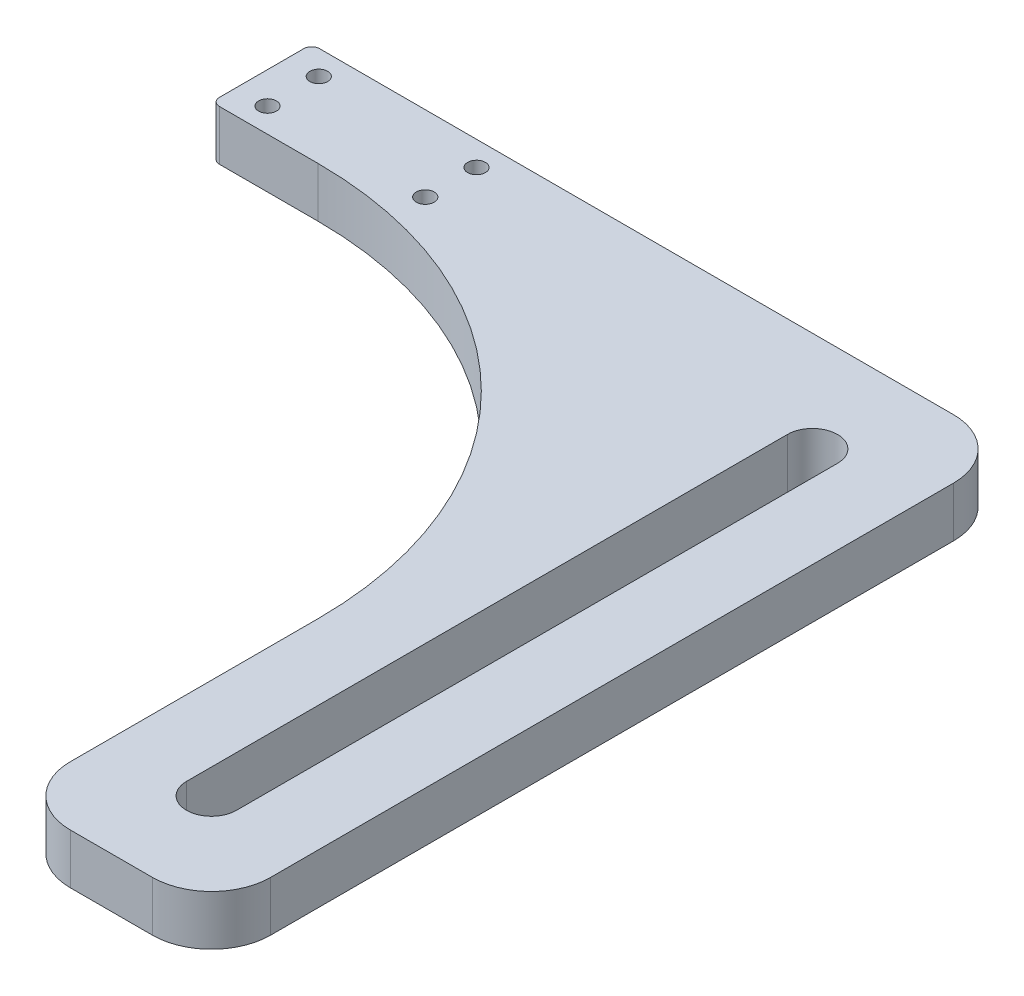
ISO-10303-21;
HEADER;
FILE_DESCRIPTION(('STEP AP214'),'2;1');
FILE_NAME('part.step','',(''),(''),'','','');
FILE_SCHEMA(('AUTOMOTIVE_DESIGN { 1 0 10303 214 1 1 1 1 }'));
ENDSEC;
DATA;
#1=APPLICATION_CONTEXT('core data for automotive mechanical design processes');
#2=APPLICATION_PROTOCOL_DEFINITION('international standard','automotive_design',2000,#1);
#3=PRODUCT_CONTEXT('',#1,'mechanical');
#4=PRODUCT('Part','Part','',(#3));
#5=PRODUCT_RELATED_PRODUCT_CATEGORY('part','',(#4));
#6=PRODUCT_DEFINITION_FORMATION('','',#4);
#7=PRODUCT_DEFINITION_CONTEXT('part definition',#1,'design');
#8=PRODUCT_DEFINITION('design','',#6,#7);
#9=PRODUCT_DEFINITION_SHAPE('','',#8);
#10=(LENGTH_UNIT() NAMED_UNIT(*) SI_UNIT(.MILLI.,.METRE.));
#11=(NAMED_UNIT(*) PLANE_ANGLE_UNIT() SI_UNIT($,.RADIAN.));
#12=(NAMED_UNIT(*) SI_UNIT($,.STERADIAN.) SOLID_ANGLE_UNIT());
#13=UNCERTAINTY_MEASURE_WITH_UNIT(LENGTH_MEASURE(1.E-05),#10,'distance_accuracy_value','');
#14=(GEOMETRIC_REPRESENTATION_CONTEXT(3) GLOBAL_UNCERTAINTY_ASSIGNED_CONTEXT((#13)) GLOBAL_UNIT_ASSIGNED_CONTEXT((#10,
#11,#12)) REPRESENTATION_CONTEXT('',''));
#15=CARTESIAN_POINT('',(0.,0.,0.));
#16=DIRECTION('',(0.,0.,1.));
#17=DIRECTION('',(1.,0.,0.));
#18=AXIS2_PLACEMENT_3D('',#15,#16,#17);
#19=CARTESIAN_POINT('',(-62.7,6.35,11.9));
#20=DIRECTION('',(0.,-1.,0.));
#21=DIRECTION('',(0.,0.,-1.));
#22=AXIS2_PLACEMENT_3D('',#19,#20,#21);
#23=PLANE('',#22);
#24=DIRECTION('',(0.,0.,-1.));
#25=VECTOR('',#24,1.);
#26=CARTESIAN_POINT('',(12.7,6.35,50.8));
#27=LINE('',#26,#25);
#28=CARTESIAN_POINT('',(12.7,6.35,43.3));
#29=VERTEX_POINT('',#28);
#30=CARTESIAN_POINT('',(12.7,6.35,-43.3));
#31=VERTEX_POINT('',#30);
#32=EDGE_CURVE('E307',#29,#31,#27,.T.);
#33=ORIENTED_EDGE('',*,*,#32,.T.);
#34=CARTESIAN_POINT('',(5.2,6.35,-43.3));
#35=DIRECTION('',(0.,-1.,0.));
#36=DIRECTION('',(0.,0.,-1.));
#37=AXIS2_PLACEMENT_3D('',#34,#35,#36);
#38=CIRCLE('',#37,7.5);
#39=CARTESIAN_POINT('',(5.2,6.35,-50.8));
#40=VERTEX_POINT('',#39);
#41=EDGE_CURVE('E286',#31,#40,#38,.F.);
#42=ORIENTED_EDGE('',*,*,#41,.T.);
#43=DIRECTION('',(-1.,0.,0.));
#44=VECTOR('',#43,1.);
#45=CARTESIAN_POINT('',(-12.7,6.35,-50.8));
#46=LINE('',#45,#44);
#47=CARTESIAN_POINT('',(-75.2,6.35,-50.8));
#48=VERTEX_POINT('',#47);
#49=EDGE_CURVE('E310',#40,#48,#46,.T.);
#50=ORIENTED_EDGE('',*,*,#49,.T.);
#51=CARTESIAN_POINT('',(-75.2,6.35,-49.8));
#52=DIRECTION('',(0.,-1.,0.));
#53=DIRECTION('',(0.,0.,-1.));
#54=AXIS2_PLACEMENT_3D('',#51,#52,#53);
#55=CIRCLE('',#54,1.);
#56=CARTESIAN_POINT('',(-76.2,6.35,-49.8));
#57=VERTEX_POINT('',#56);
#58=EDGE_CURVE('E337',#48,#57,#55,.F.);
#59=ORIENTED_EDGE('',*,*,#58,.T.);
#60=DIRECTION('',(0.,0.,1.));
#61=VECTOR('',#60,1.);
#62=CARTESIAN_POINT('',(-76.2,6.35,-50.8));
#63=LINE('',#62,#61);
#64=CARTESIAN_POINT('',(-76.2,6.35,-39.1));
#65=VERTEX_POINT('',#64);
#66=EDGE_CURVE('E405',#57,#65,#63,.T.);
#67=ORIENTED_EDGE('',*,*,#66,.T.);
#68=CARTESIAN_POINT('',(-75.2,6.35,-39.1));
#69=DIRECTION('',(0.,-1.,0.));
#70=DIRECTION('',(0.,0.,-1.));
#71=AXIS2_PLACEMENT_3D('',#68,#69,#70);
#72=CIRCLE('',#71,1.);
#73=CARTESIAN_POINT('',(-75.2,6.35,-38.1));
#74=VERTEX_POINT('',#73);
#75=EDGE_CURVE('E335',#65,#74,#72,.F.);
#76=ORIENTED_EDGE('',*,*,#75,.T.);
#77=DIRECTION('',(1.,0.,0.));
#78=VECTOR('',#77,1.);
#79=CARTESIAN_POINT('',(-76.2,6.35,-38.1));
#80=LINE('',#79,#78);
#81=CARTESIAN_POINT('',(-62.7,6.35,-38.1));
#82=VERTEX_POINT('',#81);
#83=EDGE_CURVE('E375',#74,#82,#80,.T.);
#84=ORIENTED_EDGE('',*,*,#83,.T.);
#85=CARTESIAN_POINT('',(-62.7,6.35,11.9));
#86=DIRECTION('',(0.,-1.,0.));
#87=DIRECTION('',(0.,0.,-1.));
#88=AXIS2_PLACEMENT_3D('',#85,#86,#87);
#89=CIRCLE('',#88,50.);
#90=CARTESIAN_POINT('',(-12.7,6.35,11.9));
#91=VERTEX_POINT('',#90);
#92=EDGE_CURVE('E373',#82,#91,#89,.T.);
#93=ORIENTED_EDGE('',*,*,#92,.T.);
#94=DIRECTION('',(0.,0.,1.));
#95=VECTOR('',#94,1.);
#96=CARTESIAN_POINT('',(-12.7,6.35,11.9));
#97=LINE('',#96,#95);
#98=CARTESIAN_POINT('',(-12.7,6.35,43.3));
#99=VERTEX_POINT('',#98);
#100=EDGE_CURVE('E372',#91,#99,#97,.T.);
#101=ORIENTED_EDGE('',*,*,#100,.T.);
#102=CARTESIAN_POINT('',(-5.19999999999999,6.35,43.3));
#103=DIRECTION('',(0.,-1.,0.));
#104=DIRECTION('',(0.,0.,-1.));
#105=AXIS2_PLACEMENT_3D('',#102,#103,#104);
#106=CIRCLE('',#105,7.5);
#107=CARTESIAN_POINT('',(-5.2,6.35,50.8));
#108=VERTEX_POINT('',#107);
#109=EDGE_CURVE('E56',#99,#108,#106,.F.);
#110=ORIENTED_EDGE('',*,*,#109,.T.);
#111=DIRECTION('',(1.,0.,0.));
#112=VECTOR('',#111,1.);
#113=CARTESIAN_POINT('',(-12.7,6.35,50.8));
#114=LINE('',#113,#112);
#115=CARTESIAN_POINT('',(5.2,6.35,50.8));
#116=VERTEX_POINT('',#115);
#117=EDGE_CURVE('E298',#108,#116,#114,.T.);
#118=ORIENTED_EDGE('',*,*,#117,.T.);
#119=CARTESIAN_POINT('',(5.2,6.35,43.3));
#120=DIRECTION('',(0.,-1.,0.));
#121=DIRECTION('',(0.,0.,-1.));
#122=AXIS2_PLACEMENT_3D('',#119,#120,#121);
#123=CIRCLE('',#122,7.5);
#124=EDGE_CURVE('E282',#116,#29,#123,.F.);
#125=ORIENTED_EDGE('',*,*,#124,.T.);
#126=EDGE_LOOP('',(#33,#42,#50,#59,#67,#76,#84,#93,#101,#110,#118,#125));
#127=FACE_BOUND('',#126,.T.);
#128=CARTESIAN_POINT('',(0.,6.35,38.1));
#129=DIRECTION('',(0.,1.,0.));
#130=DIRECTION('',(0.,0.,1.));
#131=AXIS2_PLACEMENT_3D('',#128,#129,#130);
#132=CIRCLE('',#131,3.175);
#133=CARTESIAN_POINT('',(-3.175,6.35,38.1));
#134=VERTEX_POINT('',#133);
#135=CARTESIAN_POINT('',(3.175,6.35,38.1));
#136=VERTEX_POINT('',#135);
#137=EDGE_CURVE('E149',#134,#136,#132,.T.);
#138=ORIENTED_EDGE('',*,*,#137,.F.);
#139=DIRECTION('',(0.,0.,1.));
#140=VECTOR('',#139,1.);
#141=CARTESIAN_POINT('',(-3.175,6.35,38.1));
#142=LINE('',#141,#140);
#143=CARTESIAN_POINT('',(-3.175,6.35,-38.1));
#144=VERTEX_POINT('',#143);
#145=EDGE_CURVE('E175',#144,#134,#142,.T.);
#146=ORIENTED_EDGE('',*,*,#145,.F.);
#147=CARTESIAN_POINT('',(0.,6.35,-38.1));
#148=DIRECTION('',(0.,1.,0.));
#149=DIRECTION('',(0.,0.,1.));
#150=AXIS2_PLACEMENT_3D('',#147,#148,#149);
#151=CIRCLE('',#150,3.175);
#152=CARTESIAN_POINT('',(3.175,6.35,-38.1));
#153=VERTEX_POINT('',#152);
#154=EDGE_CURVE('E173',#153,#144,#151,.T.);
#155=ORIENTED_EDGE('',*,*,#154,.F.);
#156=DIRECTION('',(0.,0.,-1.));
#157=VECTOR('',#156,1.);
#158=CARTESIAN_POINT('',(3.175,6.35,38.1));
#159=LINE('',#158,#157);
#160=EDGE_CURVE('E159',#136,#153,#159,.T.);
#161=ORIENTED_EDGE('',*,*,#160,.F.);
#162=EDGE_LOOP('',(#138,#146,#155,#161));
#163=FACE_BOUND('',#162,.T.);
#164=CARTESIAN_POINT('',(-72.2,6.35,-47.7));
#165=DIRECTION('',(0.,1.,0.));
#166=DIRECTION('',(0.,0.,1.));
#167=AXIS2_PLACEMENT_3D('',#164,#165,#166);
#168=CIRCLE('',#167,1.1303);
#169=CARTESIAN_POINT('',(-72.2,6.35,-46.5697));
#170=VERTEX_POINT('',#169);
#171=EDGE_CURVE('E189',#170,#170,#168,.T.);
#172=ORIENTED_EDGE('',*,*,#171,.F.);
#173=EDGE_LOOP('',(#172));
#174=FACE_BOUND('',#173,.T.);
#175=CARTESIAN_POINT('',(-72.2,6.35,-41.2));
#176=DIRECTION('',(0.,1.,0.));
#177=DIRECTION('',(0.,0.,1.));
#178=AXIS2_PLACEMENT_3D('',#175,#176,#177);
#179=CIRCLE('',#178,1.1303);
#180=CARTESIAN_POINT('',(-72.2,6.35,-40.0697));
#181=VERTEX_POINT('',#180);
#182=EDGE_CURVE('E197',#181,#181,#179,.T.);
#183=ORIENTED_EDGE('',*,*,#182,.F.);
#184=EDGE_LOOP('',(#183));
#185=FACE_BOUND('',#184,.T.);
#186=CARTESIAN_POINT('',(-52.2,6.35,-47.7));
#187=DIRECTION('',(0.,1.,0.));
#188=DIRECTION('',(0.,0.,1.));
#189=AXIS2_PLACEMENT_3D('',#186,#187,#188);
#190=CIRCLE('',#189,1.1303);
#191=CARTESIAN_POINT('',(-52.2,6.35,-46.5697));
#192=VERTEX_POINT('',#191);
#193=EDGE_CURVE('E204',#192,#192,#190,.T.);
#194=ORIENTED_EDGE('',*,*,#193,.F.);
#195=EDGE_LOOP('',(#194));
#196=FACE_BOUND('',#195,.T.);
#197=CARTESIAN_POINT('',(-52.2,6.35,-41.2));
#198=DIRECTION('',(0.,1.,0.));
#199=DIRECTION('',(0.,0.,1.));
#200=AXIS2_PLACEMENT_3D('',#197,#198,#199);
#201=CIRCLE('',#200,1.1303);
#202=CARTESIAN_POINT('',(-52.2,6.35,-40.0697));
#203=VERTEX_POINT('',#202);
#204=EDGE_CURVE('E210',#203,#203,#201,.T.);
#205=ORIENTED_EDGE('',*,*,#204,.F.);
#206=EDGE_LOOP('',(#205));
#207=FACE_BOUND('',#206,.T.);
#208=ADVANCED_FACE('F35',(#127,#163,#174,#185,#196,#207),#23,.F.);
#209=CARTESIAN_POINT('',(-62.7,0.,11.9));
#210=DIRECTION('',(0.,-1.,0.));
#211=DIRECTION('',(0.,0.,-1.));
#212=AXIS2_PLACEMENT_3D('',#209,#210,#211);
#213=PLANE('',#212);
#214=CARTESIAN_POINT('',(-52.2,0.,-47.7));
#215=DIRECTION('',(0.,1.,0.));
#216=DIRECTION('',(0.,0.,1.));
#217=AXIS2_PLACEMENT_3D('',#214,#215,#216);
#218=CIRCLE('',#217,1.1303);
#219=CARTESIAN_POINT('',(-52.2,0.,-46.5697));
#220=VERTEX_POINT('',#219);
#221=EDGE_CURVE('E207',#220,#220,#218,.T.);
#222=ORIENTED_EDGE('',*,*,#221,.T.);
#223=EDGE_LOOP('',(#222));
#224=FACE_BOUND('',#223,.T.);
#225=CARTESIAN_POINT('',(-72.2,0.,-47.7));
#226=DIRECTION('',(0.,1.,0.));
#227=DIRECTION('',(0.,0.,1.));
#228=AXIS2_PLACEMENT_3D('',#225,#226,#227);
#229=CIRCLE('',#228,1.1303);
#230=CARTESIAN_POINT('',(-72.2,0.,-46.5697));
#231=VERTEX_POINT('',#230);
#232=EDGE_CURVE('E194',#231,#231,#229,.T.);
#233=ORIENTED_EDGE('',*,*,#232,.T.);
#234=EDGE_LOOP('',(#233));
#235=FACE_BOUND('',#234,.T.);
#236=DIRECTION('',(-1.,0.,0.));
#237=VECTOR('',#236,1.);
#238=CARTESIAN_POINT('',(-12.7,0.,-50.8));
#239=LINE('',#238,#237);
#240=CARTESIAN_POINT('',(5.2,0.,-50.8));
#241=VERTEX_POINT('',#240);
#242=CARTESIAN_POINT('',(-75.2,0.,-50.8));
#243=VERTEX_POINT('',#242);
#244=EDGE_CURVE('E354',#241,#243,#239,.T.);
#245=ORIENTED_EDGE('',*,*,#244,.F.);
#246=CARTESIAN_POINT('',(5.2,0.,-43.3));
#247=DIRECTION('',(0.,-1.,0.));
#248=DIRECTION('',(0.,0.,-1.));
#249=AXIS2_PLACEMENT_3D('',#246,#247,#248);
#250=CIRCLE('',#249,7.5);
#251=CARTESIAN_POINT('',(12.7,0.,-43.3));
#252=VERTEX_POINT('',#251);
#253=EDGE_CURVE('E347',#241,#252,#250,.T.);
#254=ORIENTED_EDGE('',*,*,#253,.T.);
#255=DIRECTION('',(0.,0.,-1.));
#256=VECTOR('',#255,1.);
#257=CARTESIAN_POINT('',(12.7,0.,50.8));
#258=LINE('',#257,#256);
#259=CARTESIAN_POINT('',(12.7,0.,43.3));
#260=VERTEX_POINT('',#259);
#261=EDGE_CURVE('E167',#260,#252,#258,.T.);
#262=ORIENTED_EDGE('',*,*,#261,.F.);
#263=CARTESIAN_POINT('',(5.2,0.,43.3));
#264=DIRECTION('',(0.,-1.,0.));
#265=DIRECTION('',(0.,0.,-1.));
#266=AXIS2_PLACEMENT_3D('',#263,#264,#265);
#267=CIRCLE('',#266,7.5);
#268=CARTESIAN_POINT('',(5.2,0.,50.8));
#269=VERTEX_POINT('',#268);
#270=EDGE_CURVE('E306',#260,#269,#267,.T.);
#271=ORIENTED_EDGE('',*,*,#270,.T.);
#272=DIRECTION('',(1.,0.,0.));
#273=VECTOR('',#272,1.);
#274=CARTESIAN_POINT('',(-12.7,0.,50.8));
#275=LINE('',#274,#273);
#276=CARTESIAN_POINT('',(-5.2,0.,50.8));
#277=VERTEX_POINT('',#276);
#278=EDGE_CURVE('E297',#277,#269,#275,.T.);
#279=ORIENTED_EDGE('',*,*,#278,.F.);
#280=CARTESIAN_POINT('',(-5.19999999999999,0.,43.3));
#281=DIRECTION('',(0.,-1.,0.));
#282=DIRECTION('',(0.,0.,-1.));
#283=AXIS2_PLACEMENT_3D('',#280,#281,#282);
#284=CIRCLE('',#283,7.5);
#285=CARTESIAN_POINT('',(-12.7,0.,43.3));
#286=VERTEX_POINT('',#285);
#287=EDGE_CURVE('E303',#277,#286,#284,.T.);
#288=ORIENTED_EDGE('',*,*,#287,.T.);
#289=DIRECTION('',(0.,0.,1.));
#290=VECTOR('',#289,1.);
#291=CARTESIAN_POINT('',(-12.7,0.,11.9));
#292=LINE('',#291,#290);
#293=CARTESIAN_POINT('',(-12.7,0.,11.9));
#294=VERTEX_POINT('',#293);
#295=EDGE_CURVE('E308',#294,#286,#292,.T.);
#296=ORIENTED_EDGE('',*,*,#295,.F.);
#297=CARTESIAN_POINT('',(-62.7,0.,11.9));
#298=DIRECTION('',(0.,-1.,0.));
#299=DIRECTION('',(0.,0.,-1.));
#300=AXIS2_PLACEMENT_3D('',#297,#298,#299);
#301=CIRCLE('',#300,50.);
#302=CARTESIAN_POINT('',(-62.7,0.,-38.1));
#303=VERTEX_POINT('',#302);
#304=EDGE_CURVE('E312',#303,#294,#301,.T.);
#305=ORIENTED_EDGE('',*,*,#304,.F.);
#306=DIRECTION('',(1.,0.,0.));
#307=VECTOR('',#306,1.);
#308=CARTESIAN_POINT('',(-76.2,0.,-38.1));
#309=LINE('',#308,#307);
#310=CARTESIAN_POINT('',(-75.2,0.,-38.1));
#311=VERTEX_POINT('',#310);
#312=EDGE_CURVE('E360',#311,#303,#309,.T.);
#313=ORIENTED_EDGE('',*,*,#312,.F.);
#314=CARTESIAN_POINT('',(-75.2,0.,-39.1));
#315=DIRECTION('',(0.,-1.,0.));
#316=DIRECTION('',(0.,0.,-1.));
#317=AXIS2_PLACEMENT_3D('',#314,#315,#316);
#318=CIRCLE('',#317,1.);
#319=CARTESIAN_POINT('',(-76.2,0.,-39.1));
#320=VERTEX_POINT('',#319);
#321=EDGE_CURVE('E327',#311,#320,#318,.T.);
#322=ORIENTED_EDGE('',*,*,#321,.T.);
#323=DIRECTION('',(0.,0.,1.));
#324=VECTOR('',#323,1.);
#325=CARTESIAN_POINT('',(-76.2,0.,-50.8));
#326=LINE('',#325,#324);
#327=CARTESIAN_POINT('',(-76.2,0.,-49.8));
#328=VERTEX_POINT('',#327);
#329=EDGE_CURVE('E357',#328,#320,#326,.T.);
#330=ORIENTED_EDGE('',*,*,#329,.F.);
#331=CARTESIAN_POINT('',(-75.2,0.,-49.8));
#332=DIRECTION('',(0.,-1.,0.));
#333=DIRECTION('',(0.,0.,-1.));
#334=AXIS2_PLACEMENT_3D('',#331,#332,#333);
#335=CIRCLE('',#334,1.);
#336=EDGE_CURVE('E329',#328,#243,#335,.T.);
#337=ORIENTED_EDGE('',*,*,#336,.T.);
#338=EDGE_LOOP('',(#245,#254,#262,#271,#279,#288,#296,#305,#313,#322,#330,#337));
#339=FACE_BOUND('',#338,.T.);
#340=DIRECTION('',(0.,0.,1.));
#341=VECTOR('',#340,1.);
#342=CARTESIAN_POINT('',(-3.175,0.,38.1));
#343=LINE('',#342,#341);
#344=CARTESIAN_POINT('',(-3.175,0.,-38.1));
#345=VERTEX_POINT('',#344);
#346=CARTESIAN_POINT('',(-3.175,0.,38.1));
#347=VERTEX_POINT('',#346);
#348=EDGE_CURVE('E160',#345,#347,#343,.T.);
#349=ORIENTED_EDGE('',*,*,#348,.T.);
#350=CARTESIAN_POINT('',(0.,0.,38.1));
#351=DIRECTION('',(0.,1.,0.));
#352=DIRECTION('',(0.,0.,1.));
#353=AXIS2_PLACEMENT_3D('',#350,#351,#352);
#354=CIRCLE('',#353,3.175);
#355=CARTESIAN_POINT('',(3.175,0.,38.1));
#356=VERTEX_POINT('',#355);
#357=EDGE_CURVE('E193',#347,#356,#354,.T.);
#358=ORIENTED_EDGE('',*,*,#357,.T.);
#359=DIRECTION('',(0.,0.,-1.));
#360=VECTOR('',#359,1.);
#361=CARTESIAN_POINT('',(3.175,0.,38.1));
#362=LINE('',#361,#360);
#363=CARTESIAN_POINT('',(3.175,0.,-38.1));
#364=VERTEX_POINT('',#363);
#365=EDGE_CURVE('E166',#356,#364,#362,.T.);
#366=ORIENTED_EDGE('',*,*,#365,.T.);
#367=CARTESIAN_POINT('',(0.,0.,-38.1));
#368=DIRECTION('',(0.,1.,0.));
#369=DIRECTION('',(0.,0.,1.));
#370=AXIS2_PLACEMENT_3D('',#367,#368,#369);
#371=CIRCLE('',#370,3.175);
#372=EDGE_CURVE('E390',#364,#345,#371,.T.);
#373=ORIENTED_EDGE('',*,*,#372,.T.);
#374=EDGE_LOOP('',(#349,#358,#366,#373));
#375=FACE_BOUND('',#374,.T.);
#376=CARTESIAN_POINT('',(-72.2,0.,-41.2));
#377=DIRECTION('',(0.,1.,0.));
#378=DIRECTION('',(0.,0.,1.));
#379=AXIS2_PLACEMENT_3D('',#376,#377,#378);
#380=CIRCLE('',#379,1.1303);
#381=CARTESIAN_POINT('',(-72.2,0.,-40.0697));
#382=VERTEX_POINT('',#381);
#383=EDGE_CURVE('E195',#382,#382,#380,.T.);
#384=ORIENTED_EDGE('',*,*,#383,.T.);
#385=EDGE_LOOP('',(#384));
#386=FACE_BOUND('',#385,.T.);
#387=CARTESIAN_POINT('',(-52.2,0.,-41.2));
#388=DIRECTION('',(0.,1.,0.));
#389=DIRECTION('',(0.,0.,1.));
#390=AXIS2_PLACEMENT_3D('',#387,#388,#389);
#391=CIRCLE('',#390,1.1303);
#392=CARTESIAN_POINT('',(-52.2,0.,-40.0697));
#393=VERTEX_POINT('',#392);
#394=EDGE_CURVE('E214',#393,#393,#391,.T.);
#395=ORIENTED_EDGE('',*,*,#394,.T.);
#396=EDGE_LOOP('',(#395));
#397=FACE_BOUND('',#396,.T.);
#398=ADVANCED_FACE('F224',(#224,#235,#339,#375,#386,#397),#213,.T.);
#399=CARTESIAN_POINT('',(12.7,6.35,50.8));
#400=DIRECTION('',(-1.,0.,0.));
#401=DIRECTION('',(0.,0.,1.));
#402=AXIS2_PLACEMENT_3D('',#399,#400,#401);
#403=PLANE('',#402);
#404=ORIENTED_EDGE('',*,*,#261,.T.);
#405=DIRECTION('',(0.,-1.,0.));
#406=VECTOR('',#405,1.);
#407=CARTESIAN_POINT('',(12.7,6.35,-43.3));
#408=LINE('',#407,#406);
#409=EDGE_CURVE('E290',#252,#31,#408,.F.);
#410=ORIENTED_EDGE('',*,*,#409,.T.);
#411=ORIENTED_EDGE('',*,*,#32,.F.);
#412=DIRECTION('',(0.,-1.,0.));
#413=VECTOR('',#412,1.);
#414=CARTESIAN_POINT('',(12.7,6.35,43.3));
#415=LINE('',#414,#413);
#416=EDGE_CURVE('E284',#29,#260,#415,.T.);
#417=ORIENTED_EDGE('',*,*,#416,.T.);
#418=EDGE_LOOP('',(#404,#410,#411,#417));
#419=FACE_BOUND('',#418,.T.);
#420=ADVANCED_FACE('F229',(#419),#403,.F.);
#421=CARTESIAN_POINT('',(-12.7,6.35,-50.8));
#422=DIRECTION('',(0.,0.,1.));
#423=DIRECTION('',(1.,0.,0.));
#424=AXIS2_PLACEMENT_3D('',#421,#422,#423);
#425=PLANE('',#424);
#426=ORIENTED_EDGE('',*,*,#49,.F.);
#427=DIRECTION('',(0.,-1.,0.));
#428=VECTOR('',#427,1.);
#429=CARTESIAN_POINT('',(5.2,6.35,-50.8));
#430=LINE('',#429,#428);
#431=EDGE_CURVE('E342',#40,#241,#430,.T.);
#432=ORIENTED_EDGE('',*,*,#431,.T.);
#433=ORIENTED_EDGE('',*,*,#244,.T.);
#434=DIRECTION('',(0.,-1.,0.));
#435=VECTOR('',#434,1.);
#436=CARTESIAN_POINT('',(-75.2,6.35,-50.8));
#437=LINE('',#436,#435);
#438=EDGE_CURVE('E332',#243,#48,#437,.F.);
#439=ORIENTED_EDGE('',*,*,#438,.T.);
#440=EDGE_LOOP('',(#426,#432,#433,#439));
#441=FACE_BOUND('',#440,.T.);
#442=ADVANCED_FACE('F254',(#441),#425,.F.);
#443=CARTESIAN_POINT('',(-76.2,6.35,-50.8));
#444=DIRECTION('',(1.,0.,0.));
#445=DIRECTION('',(0.,0.,-1.));
#446=AXIS2_PLACEMENT_3D('',#443,#444,#445);
#447=PLANE('',#446);
#448=ORIENTED_EDGE('',*,*,#66,.F.);
#449=DIRECTION('',(0.,-1.,0.));
#450=VECTOR('',#449,1.);
#451=CARTESIAN_POINT('',(-76.2,6.35,-49.8));
#452=LINE('',#451,#450);
#453=EDGE_CURVE('E324',#57,#328,#452,.T.);
#454=ORIENTED_EDGE('',*,*,#453,.T.);
#455=ORIENTED_EDGE('',*,*,#329,.T.);
#456=DIRECTION('',(0.,-1.,0.));
#457=VECTOR('',#456,1.);
#458=CARTESIAN_POINT('',(-76.2,6.35,-39.1));
#459=LINE('',#458,#457);
#460=EDGE_CURVE('E322',#320,#65,#459,.F.);
#461=ORIENTED_EDGE('',*,*,#460,.T.);
#462=EDGE_LOOP('',(#448,#454,#455,#461));
#463=FACE_BOUND('',#462,.T.);
#464=ADVANCED_FACE('F250',(#463),#447,.F.);
#465=CARTESIAN_POINT('',(-76.2,6.35,-38.1));
#466=DIRECTION('',(0.,0.,-1.));
#467=DIRECTION('',(-1.,0.,0.));
#468=AXIS2_PLACEMENT_3D('',#465,#466,#467);
#469=PLANE('',#468);
#470=ORIENTED_EDGE('',*,*,#83,.F.);
#471=DIRECTION('',(0.,-1.,0.));
#472=VECTOR('',#471,1.);
#473=CARTESIAN_POINT('',(-75.2,6.35,-38.1));
#474=LINE('',#473,#472);
#475=EDGE_CURVE('E339',#74,#311,#474,.T.);
#476=ORIENTED_EDGE('',*,*,#475,.T.);
#477=ORIENTED_EDGE('',*,*,#312,.T.);
#478=DIRECTION('',(0.,-1.,0.));
#479=VECTOR('',#478,1.);
#480=CARTESIAN_POINT('',(-62.7,6.35,-38.1));
#481=LINE('',#480,#479);
#482=EDGE_CURVE('E319',#82,#303,#481,.T.);
#483=ORIENTED_EDGE('',*,*,#482,.F.);
#484=EDGE_LOOP('',(#470,#476,#477,#483));
#485=FACE_BOUND('',#484,.T.);
#486=ADVANCED_FACE('F246',(#485),#469,.F.);
#487=CARTESIAN_POINT('',(-62.7,6.35,11.9));
#488=DIRECTION('',(0.,-1.,0.));
#489=DIRECTION('',(0.,0.,-1.));
#490=AXIS2_PLACEMENT_3D('',#487,#488,#489);
#491=CYLINDRICAL_SURFACE('',#490,50.);
#492=ORIENTED_EDGE('',*,*,#304,.T.);
#493=DIRECTION('',(0.,-1.,0.));
#494=VECTOR('',#493,1.);
#495=CARTESIAN_POINT('',(-12.7,6.35,11.9));
#496=LINE('',#495,#494);
#497=EDGE_CURVE('E316',#91,#294,#496,.T.);
#498=ORIENTED_EDGE('',*,*,#497,.F.);
#499=ORIENTED_EDGE('',*,*,#92,.F.);
#500=ORIENTED_EDGE('',*,*,#482,.T.);
#501=EDGE_LOOP('',(#492,#498,#499,#500));
#502=FACE_BOUND('',#501,.T.);
#503=ADVANCED_FACE('F242',(#502),#491,.F.);
#504=CARTESIAN_POINT('',(-12.7,6.35,11.9));
#505=DIRECTION('',(1.,0.,0.));
#506=DIRECTION('',(0.,0.,-1.));
#507=AXIS2_PLACEMENT_3D('',#504,#505,#506);
#508=PLANE('',#507);
#509=ORIENTED_EDGE('',*,*,#295,.T.);
#510=DIRECTION('',(0.,-1.,0.));
#511=VECTOR('',#510,1.);
#512=CARTESIAN_POINT('',(-12.7,6.35,43.3));
#513=LINE('',#512,#511);
#514=EDGE_CURVE('E12',#286,#99,#513,.F.);
#515=ORIENTED_EDGE('',*,*,#514,.T.);
#516=ORIENTED_EDGE('',*,*,#100,.F.);
#517=ORIENTED_EDGE('',*,*,#497,.T.);
#518=EDGE_LOOP('',(#509,#515,#516,#517));
#519=FACE_BOUND('',#518,.T.);
#520=ADVANCED_FACE('F239',(#519),#508,.F.);
#521=CARTESIAN_POINT('',(-12.7,6.35,50.8));
#522=DIRECTION('',(0.,0.,-1.));
#523=DIRECTION('',(-1.,0.,0.));
#524=AXIS2_PLACEMENT_3D('',#521,#522,#523);
#525=PLANE('',#524);
#526=ORIENTED_EDGE('',*,*,#278,.T.);
#527=DIRECTION('',(0.,-1.,0.));
#528=VECTOR('',#527,1.);
#529=CARTESIAN_POINT('',(5.2,6.35,50.8));
#530=LINE('',#529,#528);
#531=EDGE_CURVE('E43',#269,#116,#530,.F.);
#532=ORIENTED_EDGE('',*,*,#531,.T.);
#533=ORIENTED_EDGE('',*,*,#117,.F.);
#534=DIRECTION('',(0.,-1.,0.));
#535=VECTOR('',#534,1.);
#536=CARTESIAN_POINT('',(-5.2,6.35,50.8));
#537=LINE('',#536,#535);
#538=EDGE_CURVE('E288',#108,#277,#537,.T.);
#539=ORIENTED_EDGE('',*,*,#538,.T.);
#540=EDGE_LOOP('',(#526,#532,#533,#539));
#541=FACE_BOUND('',#540,.T.);
#542=ADVANCED_FACE('F236',(#541),#525,.F.);
#543=CARTESIAN_POINT('',(0.,6.35,38.1));
#544=DIRECTION('',(0.,-1.,0.));
#545=DIRECTION('',(0.,0.,-1.));
#546=AXIS2_PLACEMENT_3D('',#543,#544,#545);
#547=CYLINDRICAL_SURFACE('',#546,3.175);
#548=ORIENTED_EDGE('',*,*,#357,.F.);
#549=DIRECTION('',(0.,-1.,0.));
#550=VECTOR('',#549,1.);
#551=CARTESIAN_POINT('',(-3.175,6.35,38.1));
#552=LINE('',#551,#550);
#553=EDGE_CURVE('E155',#134,#347,#552,.T.);
#554=ORIENTED_EDGE('',*,*,#553,.F.);
#555=ORIENTED_EDGE('',*,*,#137,.T.);
#556=DIRECTION('',(0.,-1.,0.));
#557=VECTOR('',#556,1.);
#558=CARTESIAN_POINT('',(3.175,6.35,38.1));
#559=LINE('',#558,#557);
#560=EDGE_CURVE('E152',#136,#356,#559,.T.);
#561=ORIENTED_EDGE('',*,*,#560,.T.);
#562=EDGE_LOOP('',(#548,#554,#555,#561));
#563=FACE_BOUND('',#562,.T.);
#564=ADVANCED_FACE('F151',(#563),#547,.F.);
#565=CARTESIAN_POINT('',(3.175,6.35,38.1));
#566=DIRECTION('',(-1.,0.,0.));
#567=DIRECTION('',(0.,0.,1.));
#568=AXIS2_PLACEMENT_3D('',#565,#566,#567);
#569=PLANE('',#568);
#570=ORIENTED_EDGE('',*,*,#365,.F.);
#571=ORIENTED_EDGE('',*,*,#560,.F.);
#572=ORIENTED_EDGE('',*,*,#160,.T.);
#573=DIRECTION('',(0.,-1.,0.));
#574=VECTOR('',#573,1.);
#575=CARTESIAN_POINT('',(3.175,6.35,-38.1));
#576=LINE('',#575,#574);
#577=EDGE_CURVE('E168',#153,#364,#576,.T.);
#578=ORIENTED_EDGE('',*,*,#577,.T.);
#579=EDGE_LOOP('',(#570,#571,#572,#578));
#580=FACE_BOUND('',#579,.T.);
#581=ADVANCED_FACE('F163',(#580),#569,.T.);
#582=CARTESIAN_POINT('',(0.,6.35,-38.1));
#583=DIRECTION('',(0.,-1.,0.));
#584=DIRECTION('',(0.,0.,-1.));
#585=AXIS2_PLACEMENT_3D('',#582,#583,#584);
#586=CYLINDRICAL_SURFACE('',#585,3.175);
#587=ORIENTED_EDGE('',*,*,#372,.F.);
#588=ORIENTED_EDGE('',*,*,#577,.F.);
#589=ORIENTED_EDGE('',*,*,#154,.T.);
#590=DIRECTION('',(0.,-1.,0.));
#591=VECTOR('',#590,1.);
#592=CARTESIAN_POINT('',(-3.175,6.35,-38.1));
#593=LINE('',#592,#591);
#594=EDGE_CURVE('E396',#144,#345,#593,.T.);
#595=ORIENTED_EDGE('',*,*,#594,.T.);
#596=EDGE_LOOP('',(#587,#588,#589,#595));
#597=FACE_BOUND('',#596,.T.);
#598=ADVANCED_FACE('F418',(#597),#586,.F.);
#599=CARTESIAN_POINT('',(-3.175,6.35,38.1));
#600=DIRECTION('',(1.,0.,0.));
#601=DIRECTION('',(0.,0.,-1.));
#602=AXIS2_PLACEMENT_3D('',#599,#600,#601);
#603=PLANE('',#602);
#604=ORIENTED_EDGE('',*,*,#348,.F.);
#605=ORIENTED_EDGE('',*,*,#594,.F.);
#606=ORIENTED_EDGE('',*,*,#145,.T.);
#607=ORIENTED_EDGE('',*,*,#553,.T.);
#608=EDGE_LOOP('',(#604,#605,#606,#607));
#609=FACE_BOUND('',#608,.T.);
#610=ADVANCED_FACE('F422',(#609),#603,.T.);
#611=CARTESIAN_POINT('',(-72.2,6.35,-47.7));
#612=DIRECTION('',(0.,-1.,0.));
#613=DIRECTION('',(0.,0.,-1.));
#614=AXIS2_PLACEMENT_3D('',#611,#612,#613);
#615=CYLINDRICAL_SURFACE('',#614,1.1303);
#616=ORIENTED_EDGE('',*,*,#171,.T.);
#617=EDGE_LOOP('',(#616));
#618=FACE_BOUND('',#617,.T.);
#619=ORIENTED_EDGE('',*,*,#232,.F.);
#620=EDGE_LOOP('',(#619));
#621=FACE_BOUND('',#620,.T.);
#622=ADVANCED_FACE('F424',(#618,#621),#615,.F.);
#623=CARTESIAN_POINT('',(-72.2,6.35,-41.2));
#624=DIRECTION('',(0.,-1.,0.));
#625=DIRECTION('',(0.,0.,-1.));
#626=AXIS2_PLACEMENT_3D('',#623,#624,#625);
#627=CYLINDRICAL_SURFACE('',#626,1.1303);
#628=ORIENTED_EDGE('',*,*,#182,.T.);
#629=EDGE_LOOP('',(#628));
#630=FACE_BOUND('',#629,.T.);
#631=ORIENTED_EDGE('',*,*,#383,.F.);
#632=EDGE_LOOP('',(#631));
#633=FACE_BOUND('',#632,.T.);
#634=ADVANCED_FACE('F430',(#630,#633),#627,.F.);
#635=CARTESIAN_POINT('',(-52.2,6.35,-47.7));
#636=DIRECTION('',(0.,-1.,0.));
#637=DIRECTION('',(0.,0.,-1.));
#638=AXIS2_PLACEMENT_3D('',#635,#636,#637);
#639=CYLINDRICAL_SURFACE('',#638,1.1303);
#640=ORIENTED_EDGE('',*,*,#193,.T.);
#641=EDGE_LOOP('',(#640));
#642=FACE_BOUND('',#641,.T.);
#643=ORIENTED_EDGE('',*,*,#221,.F.);
#644=EDGE_LOOP('',(#643));
#645=FACE_BOUND('',#644,.T.);
#646=ADVANCED_FACE('F500',(#642,#645),#639,.F.);
#647=CARTESIAN_POINT('',(-52.2,6.35,-41.2));
#648=DIRECTION('',(0.,-1.,0.));
#649=DIRECTION('',(0.,0.,-1.));
#650=AXIS2_PLACEMENT_3D('',#647,#648,#649);
#651=CYLINDRICAL_SURFACE('',#650,1.1303);
#652=ORIENTED_EDGE('',*,*,#204,.T.);
#653=EDGE_LOOP('',(#652));
#654=FACE_BOUND('',#653,.T.);
#655=ORIENTED_EDGE('',*,*,#394,.F.);
#656=EDGE_LOOP('',(#655));
#657=FACE_BOUND('',#656,.T.);
#658=ADVANCED_FACE('F220',(#654,#657),#651,.F.);
#659=CARTESIAN_POINT('',(-75.2,6.35,-49.8));
#660=DIRECTION('',(0.,-1.,0.));
#661=DIRECTION('',(0.,0.,-1.));
#662=AXIS2_PLACEMENT_3D('',#659,#660,#661);
#663=CYLINDRICAL_SURFACE('',#662,1.);
#664=ORIENTED_EDGE('',*,*,#58,.F.);
#665=ORIENTED_EDGE('',*,*,#438,.F.);
#666=ORIENTED_EDGE('',*,*,#336,.F.);
#667=ORIENTED_EDGE('',*,*,#453,.F.);
#668=EDGE_LOOP('',(#664,#665,#666,#667));
#669=FACE_BOUND('',#668,.T.);
#670=ADVANCED_FACE('F262',(#669),#663,.T.);
#671=CARTESIAN_POINT('',(-75.2,6.35,-39.1));
#672=DIRECTION('',(0.,-1.,0.));
#673=DIRECTION('',(0.,0.,-1.));
#674=AXIS2_PLACEMENT_3D('',#671,#672,#673);
#675=CYLINDRICAL_SURFACE('',#674,1.);
#676=ORIENTED_EDGE('',*,*,#75,.F.);
#677=ORIENTED_EDGE('',*,*,#460,.F.);
#678=ORIENTED_EDGE('',*,*,#321,.F.);
#679=ORIENTED_EDGE('',*,*,#475,.F.);
#680=EDGE_LOOP('',(#676,#677,#678,#679));
#681=FACE_BOUND('',#680,.T.);
#682=ADVANCED_FACE('F265',(#681),#675,.T.);
#683=CARTESIAN_POINT('',(5.2,6.35,-43.3));
#684=DIRECTION('',(0.,-1.,0.));
#685=DIRECTION('',(0.,0.,-1.));
#686=AXIS2_PLACEMENT_3D('',#683,#684,#685);
#687=CYLINDRICAL_SURFACE('',#686,7.5);
#688=ORIENTED_EDGE('',*,*,#41,.F.);
#689=ORIENTED_EDGE('',*,*,#409,.F.);
#690=ORIENTED_EDGE('',*,*,#253,.F.);
#691=ORIENTED_EDGE('',*,*,#431,.F.);
#692=EDGE_LOOP('',(#688,#689,#690,#691));
#693=FACE_BOUND('',#692,.T.);
#694=ADVANCED_FACE('F269',(#693),#687,.T.);
#695=CARTESIAN_POINT('',(5.2,6.35,43.3));
#696=DIRECTION('',(0.,-1.,0.));
#697=DIRECTION('',(0.,0.,-1.));
#698=AXIS2_PLACEMENT_3D('',#695,#696,#697);
#699=CYLINDRICAL_SURFACE('',#698,7.5);
#700=ORIENTED_EDGE('',*,*,#124,.F.);
#701=ORIENTED_EDGE('',*,*,#531,.F.);
#702=ORIENTED_EDGE('',*,*,#270,.F.);
#703=ORIENTED_EDGE('',*,*,#416,.F.);
#704=EDGE_LOOP('',(#700,#701,#702,#703));
#705=FACE_BOUND('',#704,.T.);
#706=ADVANCED_FACE('F272',(#705),#699,.T.);
#707=CARTESIAN_POINT('',(-5.19999999999999,6.35,43.3));
#708=DIRECTION('',(0.,-1.,0.));
#709=DIRECTION('',(0.,0.,-1.));
#710=AXIS2_PLACEMENT_3D('',#707,#708,#709);
#711=CYLINDRICAL_SURFACE('',#710,7.5);
#712=ORIENTED_EDGE('',*,*,#109,.F.);
#713=ORIENTED_EDGE('',*,*,#514,.F.);
#714=ORIENTED_EDGE('',*,*,#287,.F.);
#715=ORIENTED_EDGE('',*,*,#538,.F.);
#716=EDGE_LOOP('',(#712,#713,#714,#715));
#717=FACE_BOUND('',#716,.T.);
#718=ADVANCED_FACE('F37',(#717),#711,.T.);
#719=CLOSED_SHELL('',(#208,#398,#420,#442,#464,#486,#503,#520,#542,#564,#581,#598,#610,#622,
#634,#646,#658,#670,#682,#694,#706,#718));
#720=MANIFOLD_SOLID_BREP('B2',#719);
#721=ADVANCED_BREP_SHAPE_REPRESENTATION('',(#18,#720),#14);
#722=SHAPE_DEFINITION_REPRESENTATION(#9,#721);
ENDSEC;
END-ISO-10303-21;
